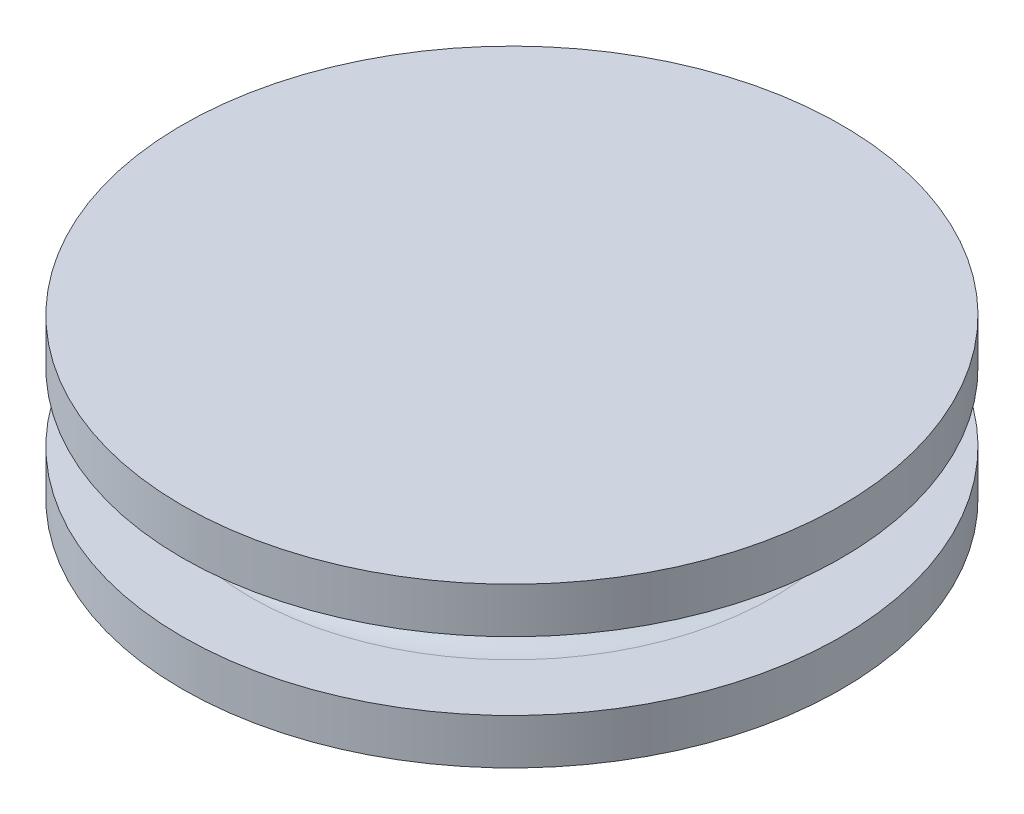
ISO-10303-21;
HEADER;
FILE_DESCRIPTION(('STEP AP214'),'2;1');
FILE_NAME('part.step','',(''),(''),'','','');
FILE_SCHEMA(('AUTOMOTIVE_DESIGN { 1 0 10303 214 1 1 1 1 }'));
ENDSEC;
DATA;
#1=APPLICATION_CONTEXT('core data for automotive mechanical design processes');
#2=APPLICATION_PROTOCOL_DEFINITION('international standard','automotive_design',2000,#1);
#3=PRODUCT_CONTEXT('',#1,'mechanical');
#4=PRODUCT('Part','Part','',(#3));
#5=PRODUCT_RELATED_PRODUCT_CATEGORY('part','',(#4));
#6=PRODUCT_DEFINITION_FORMATION('','',#4);
#7=PRODUCT_DEFINITION_CONTEXT('part definition',#1,'design');
#8=PRODUCT_DEFINITION('design','',#6,#7);
#9=PRODUCT_DEFINITION_SHAPE('','',#8);
#10=(LENGTH_UNIT() NAMED_UNIT(*) SI_UNIT(.MILLI.,.METRE.));
#11=(NAMED_UNIT(*) PLANE_ANGLE_UNIT() SI_UNIT($,.RADIAN.));
#12=(NAMED_UNIT(*) SI_UNIT($,.STERADIAN.) SOLID_ANGLE_UNIT());
#13=UNCERTAINTY_MEASURE_WITH_UNIT(LENGTH_MEASURE(1.E-05),#10,'distance_accuracy_value','');
#14=(GEOMETRIC_REPRESENTATION_CONTEXT(3) GLOBAL_UNCERTAINTY_ASSIGNED_CONTEXT((#13)) GLOBAL_UNIT_ASSIGNED_CONTEXT((#10,
#11,#12)) REPRESENTATION_CONTEXT('',''));
#15=CARTESIAN_POINT('',(0.,0.,0.));
#16=DIRECTION('',(0.,0.,1.));
#17=DIRECTION('',(1.,0.,0.));
#18=AXIS2_PLACEMENT_3D('',#15,#16,#17);
#19=CARTESIAN_POINT('',(0.,-3.5,0.));
#20=DIRECTION('',(0.,-1.,0.));
#21=DIRECTION('',(0.,0.,-1.));
#22=AXIS2_PLACEMENT_3D('',#19,#20,#21);
#23=PLANE('',#22);
#24=CARTESIAN_POINT('',(0.,-3.5,0.));
#25=DIRECTION('',(0.,1.,0.));
#26=DIRECTION('',(0.,0.,1.));
#27=AXIS2_PLACEMENT_3D('',#24,#25,#26);
#28=CIRCLE('',#27,14.5);
#29=CARTESIAN_POINT('',(0.,-3.5,14.5));
#30=VERTEX_POINT('',#29);
#31=EDGE_CURVE('E10',#30,#30,#28,.T.);
#32=ORIENTED_EDGE('',*,*,#31,.F.);
#33=EDGE_LOOP('',(#32));
#34=FACE_BOUND('',#33,.T.);
#35=ADVANCED_FACE('F33',(#34),#23,.T.);
#36=CARTESIAN_POINT('',(0.,3.5,0.));
#37=DIRECTION('',(0.,1.,0.));
#38=DIRECTION('',(0.,0.,1.));
#39=AXIS2_PLACEMENT_3D('',#36,#37,#38);
#40=CYLINDRICAL_SURFACE('',#39,14.5);
#41=ORIENTED_EDGE('',*,*,#31,.T.);
#42=EDGE_LOOP('',(#41));
#43=FACE_BOUND('',#42,.T.);
#44=CARTESIAN_POINT('',(0.,-1.5,0.));
#45=DIRECTION('',(0.,1.,0.));
#46=DIRECTION('',(0.,0.,1.));
#47=AXIS2_PLACEMENT_3D('',#44,#45,#46);
#48=CIRCLE('',#47,14.5);
#49=CARTESIAN_POINT('',(0.,-1.5,14.5));
#50=VERTEX_POINT('',#49);
#51=EDGE_CURVE('E39',#50,#50,#48,.T.);
#52=ORIENTED_EDGE('',*,*,#51,.F.);
#53=EDGE_LOOP('',(#52));
#54=FACE_BOUND('',#53,.T.);
#55=ADVANCED_FACE('F75',(#43,#54),#40,.T.);
#56=CARTESIAN_POINT('',(-14.5,-1.5,0.));
#57=DIRECTION('',(0.,1.,0.));
#58=DIRECTION('',(0.,0.,1.));
#59=AXIS2_PLACEMENT_3D('',#56,#57,#58);
#60=PLANE('',#59);
#61=ORIENTED_EDGE('',*,*,#51,.T.);
#62=EDGE_LOOP('',(#61));
#63=FACE_BOUND('',#62,.T.);
#64=CARTESIAN_POINT('',(0.,-1.5,0.));
#65=DIRECTION('',(0.,1.,0.));
#66=DIRECTION('',(0.,0.,1.));
#67=AXIS2_PLACEMENT_3D('',#64,#65,#66);
#68=CIRCLE('',#67,11.5);
#69=CARTESIAN_POINT('',(0.,-1.5,11.5));
#70=VERTEX_POINT('',#69);
#71=EDGE_CURVE('E43',#70,#70,#68,.T.);
#72=ORIENTED_EDGE('',*,*,#71,.F.);
#73=EDGE_LOOP('',(#72));
#74=FACE_BOUND('',#73,.T.);
#75=ADVANCED_FACE('F80',(#63,#74),#60,.T.);
#76=CARTESIAN_POINT('',(0.,0.,0.));
#77=DIRECTION('',(0.,1.,0.));
#78=DIRECTION('',(0.,0.,1.));
#79=AXIS2_PLACEMENT_3D('',#76,#77,#78);
#80=TOROIDAL_SURFACE('',#79,11.5,1.5);
#81=ORIENTED_EDGE('',*,*,#71,.T.);
#82=EDGE_LOOP('',(#81));
#83=FACE_BOUND('',#82,.T.);
#84=CARTESIAN_POINT('',(0.,1.5,0.));
#85=DIRECTION('',(0.,1.,0.));
#86=DIRECTION('',(0.,0.,1.));
#87=AXIS2_PLACEMENT_3D('',#84,#85,#86);
#88=CIRCLE('',#87,11.5);
#89=CARTESIAN_POINT('',(0.,1.5,11.5));
#90=VERTEX_POINT('',#89);
#91=EDGE_CURVE('E47',#90,#90,#88,.T.);
#92=ORIENTED_EDGE('',*,*,#91,.F.);
#93=EDGE_LOOP('',(#92));
#94=FACE_BOUND('',#93,.T.);
#95=ADVANCED_FACE('F71',(#83,#94),#80,.F.);
#96=CARTESIAN_POINT('',(-14.5,1.5,0.));
#97=DIRECTION('',(0.,-1.,0.));
#98=DIRECTION('',(0.,0.,-1.));
#99=AXIS2_PLACEMENT_3D('',#96,#97,#98);
#100=PLANE('',#99);
#101=ORIENTED_EDGE('',*,*,#91,.T.);
#102=EDGE_LOOP('',(#101));
#103=FACE_BOUND('',#102,.T.);
#104=CARTESIAN_POINT('',(0.,1.5,0.));
#105=DIRECTION('',(0.,1.,0.));
#106=DIRECTION('',(0.,0.,1.));
#107=AXIS2_PLACEMENT_3D('',#104,#105,#106);
#108=CIRCLE('',#107,14.5);
#109=CARTESIAN_POINT('',(0.,1.5,14.5));
#110=VERTEX_POINT('',#109);
#111=EDGE_CURVE('E52',#110,#110,#108,.T.);
#112=ORIENTED_EDGE('',*,*,#111,.F.);
#113=EDGE_LOOP('',(#112));
#114=FACE_BOUND('',#113,.T.);
#115=ADVANCED_FACE('F63',(#103,#114),#100,.T.);
#116=CARTESIAN_POINT('',(0.,3.5,0.));
#117=DIRECTION('',(0.,1.,0.));
#118=DIRECTION('',(0.,0.,1.));
#119=AXIS2_PLACEMENT_3D('',#116,#117,#118);
#120=CYLINDRICAL_SURFACE('',#119,14.5);
#121=ORIENTED_EDGE('',*,*,#111,.T.);
#122=EDGE_LOOP('',(#121));
#123=FACE_BOUND('',#122,.T.);
#124=CARTESIAN_POINT('',(0.,3.5,0.));
#125=DIRECTION('',(0.,1.,0.));
#126=DIRECTION('',(0.,0.,1.));
#127=AXIS2_PLACEMENT_3D('',#124,#125,#126);
#128=CIRCLE('',#127,14.5);
#129=CARTESIAN_POINT('',(0.,3.5,14.5));
#130=VERTEX_POINT('',#129);
#131=EDGE_CURVE('E55',#130,#130,#128,.T.);
#132=ORIENTED_EDGE('',*,*,#131,.F.);
#133=EDGE_LOOP('',(#132));
#134=FACE_BOUND('',#133,.T.);
#135=ADVANCED_FACE('F61',(#123,#134),#120,.T.);
#136=CARTESIAN_POINT('',(0.,3.5,0.));
#137=DIRECTION('',(0.,1.,0.));
#138=DIRECTION('',(0.,0.,1.));
#139=AXIS2_PLACEMENT_3D('',#136,#137,#138);
#140=PLANE('',#139);
#141=ORIENTED_EDGE('',*,*,#131,.T.);
#142=EDGE_LOOP('',(#141));
#143=FACE_BOUND('',#142,.T.);
#144=ADVANCED_FACE('F59',(#143),#140,.T.);
#145=CLOSED_SHELL('',(#35,#55,#75,#95,#115,#135,#144));
#146=MANIFOLD_SOLID_BREP('B2',#145);
#147=ADVANCED_BREP_SHAPE_REPRESENTATION('',(#18,#146),#14);
#148=SHAPE_DEFINITION_REPRESENTATION(#9,#147);
ENDSEC;
END-ISO-10303-21;
